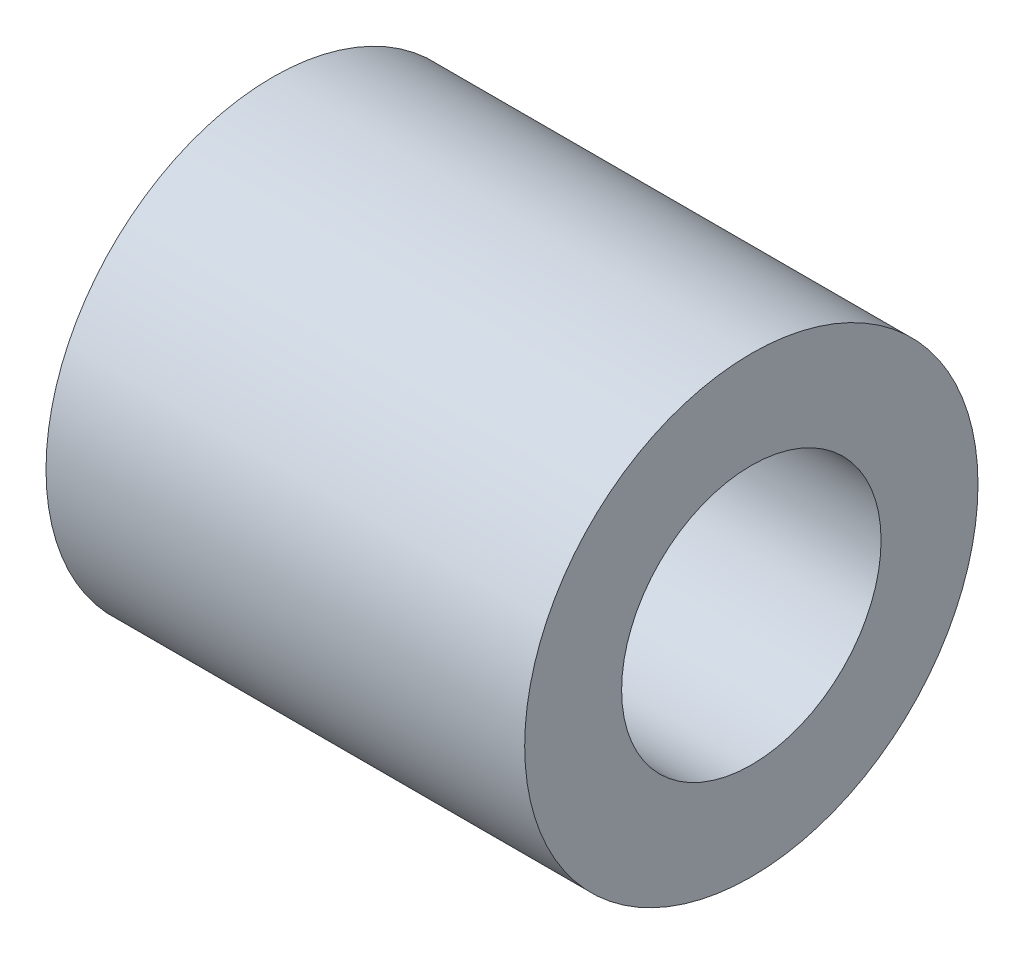
ISO-10303-21;
HEADER;
FILE_DESCRIPTION(('STEP AP214'),'2;1');
FILE_NAME('part.step','',(''),(''),'','','');
FILE_SCHEMA(('AUTOMOTIVE_DESIGN { 1 0 10303 214 1 1 1 1 }'));
ENDSEC;
DATA;
#1=APPLICATION_CONTEXT('core data for automotive mechanical design processes');
#2=APPLICATION_PROTOCOL_DEFINITION('international standard','automotive_design',2000,#1);
#3=PRODUCT_CONTEXT('',#1,'mechanical');
#4=PRODUCT('Part','Part','',(#3));
#5=PRODUCT_RELATED_PRODUCT_CATEGORY('part','',(#4));
#6=PRODUCT_DEFINITION_FORMATION('','',#4);
#7=PRODUCT_DEFINITION_CONTEXT('part definition',#1,'design');
#8=PRODUCT_DEFINITION('design','',#6,#7);
#9=PRODUCT_DEFINITION_SHAPE('','',#8);
#10=(LENGTH_UNIT() NAMED_UNIT(*) SI_UNIT(.MILLI.,.METRE.));
#11=(NAMED_UNIT(*) PLANE_ANGLE_UNIT() SI_UNIT($,.RADIAN.));
#12=(NAMED_UNIT(*) SI_UNIT($,.STERADIAN.) SOLID_ANGLE_UNIT());
#13=UNCERTAINTY_MEASURE_WITH_UNIT(LENGTH_MEASURE(1.E-05),#10,'distance_accuracy_value','');
#14=(GEOMETRIC_REPRESENTATION_CONTEXT(3) GLOBAL_UNCERTAINTY_ASSIGNED_CONTEXT((#13)) GLOBAL_UNIT_ASSIGNED_CONTEXT((#10,
#11,#12)) REPRESENTATION_CONTEXT('',''));
#15=CARTESIAN_POINT('',(0.,0.,0.));
#16=DIRECTION('',(0.,0.,1.));
#17=DIRECTION('',(1.,0.,0.));
#18=AXIS2_PLACEMENT_3D('',#15,#16,#17);
#19=CARTESIAN_POINT('',(100.,0.,0.));
#20=DIRECTION('',(1.,0.,0.));
#21=DIRECTION('',(0.,0.,-1.));
#22=AXIS2_PLACEMENT_3D('',#19,#20,#21);
#23=PLANE('',#22);
#24=CARTESIAN_POINT('',(100.,0.,0.));
#25=DIRECTION('',(1.,0.,0.));
#26=DIRECTION('',(0.,0.,-1.));
#27=AXIS2_PLACEMENT_3D('',#24,#25,#26);
#28=CIRCLE('',#27,47.35);
#29=CARTESIAN_POINT('',(100.,0.,-47.35));
#30=VERTEX_POINT('',#29);
#31=EDGE_CURVE('E10',#30,#30,#28,.T.);
#32=ORIENTED_EDGE('',*,*,#31,.T.);
#33=EDGE_LOOP('',(#32));
#34=FACE_BOUND('',#33,.T.);
#35=CARTESIAN_POINT('',(100.,0.,0.));
#36=DIRECTION('',(1.,0.,0.));
#37=DIRECTION('',(0.,0.,-1.));
#38=AXIS2_PLACEMENT_3D('',#35,#36,#37);
#39=CIRCLE('',#38,27.1);
#40=CARTESIAN_POINT('',(100.,0.,-27.1));
#41=VERTEX_POINT('',#40);
#42=EDGE_CURVE('E48',#41,#41,#39,.T.);
#43=ORIENTED_EDGE('',*,*,#42,.F.);
#44=EDGE_LOOP('',(#43));
#45=FACE_BOUND('',#44,.T.);
#46=ADVANCED_FACE('F37',(#34,#45),#23,.T.);
#47=CARTESIAN_POINT('',(0.,0.,0.));
#48=DIRECTION('',(1.,0.,0.));
#49=DIRECTION('',(0.,0.,-1.));
#50=AXIS2_PLACEMENT_3D('',#47,#48,#49);
#51=PLANE('',#50);
#52=CARTESIAN_POINT('',(0.,0.,0.));
#53=DIRECTION('',(1.,0.,0.));
#54=DIRECTION('',(0.,0.,-1.));
#55=AXIS2_PLACEMENT_3D('',#52,#53,#54);
#56=CIRCLE('',#55,47.35);
#57=CARTESIAN_POINT('',(0.,0.,-47.35));
#58=VERTEX_POINT('',#57);
#59=EDGE_CURVE('E41',#58,#58,#56,.T.);
#60=ORIENTED_EDGE('',*,*,#59,.F.);
#61=EDGE_LOOP('',(#60));
#62=FACE_BOUND('',#61,.T.);
#63=CARTESIAN_POINT('',(0.,0.,0.));
#64=DIRECTION('',(1.,0.,0.));
#65=DIRECTION('',(0.,0.,-1.));
#66=AXIS2_PLACEMENT_3D('',#63,#64,#65);
#67=CIRCLE('',#66,27.1);
#68=CARTESIAN_POINT('',(0.,0.,-27.1));
#69=VERTEX_POINT('',#68);
#70=EDGE_CURVE('E50',#69,#69,#67,.T.);
#71=ORIENTED_EDGE('',*,*,#70,.T.);
#72=EDGE_LOOP('',(#71));
#73=FACE_BOUND('',#72,.T.);
#74=ADVANCED_FACE('F60',(#62,#73),#51,.F.);
#75=CARTESIAN_POINT('',(100.,0.,0.));
#76=DIRECTION('',(-1.,0.,0.));
#77=DIRECTION('',(0.,0.,1.));
#78=AXIS2_PLACEMENT_3D('',#75,#76,#77);
#79=CYLINDRICAL_SURFACE('',#78,47.35);
#80=ORIENTED_EDGE('',*,*,#31,.F.);
#81=EDGE_LOOP('',(#80));
#82=FACE_BOUND('',#81,.T.);
#83=ORIENTED_EDGE('',*,*,#59,.T.);
#84=EDGE_LOOP('',(#83));
#85=FACE_BOUND('',#84,.T.);
#86=ADVANCED_FACE('F39',(#82,#85),#79,.T.);
#87=CARTESIAN_POINT('',(100.,0.,0.));
#88=DIRECTION('',(-1.,0.,0.));
#89=DIRECTION('',(0.,0.,1.));
#90=AXIS2_PLACEMENT_3D('',#87,#88,#89);
#91=CYLINDRICAL_SURFACE('',#90,27.1);
#92=ORIENTED_EDGE('',*,*,#42,.T.);
#93=EDGE_LOOP('',(#92));
#94=FACE_BOUND('',#93,.T.);
#95=ORIENTED_EDGE('',*,*,#70,.F.);
#96=EDGE_LOOP('',(#95));
#97=FACE_BOUND('',#96,.T.);
#98=ADVANCED_FACE('F56',(#94,#97),#91,.F.);
#99=CLOSED_SHELL('',(#46,#74,#86,#98));
#100=MANIFOLD_SOLID_BREP('B2',#99);
#101=ADVANCED_BREP_SHAPE_REPRESENTATION('',(#18,#100),#14);
#102=SHAPE_DEFINITION_REPRESENTATION(#9,#101);
ENDSEC;
END-ISO-10303-21;
